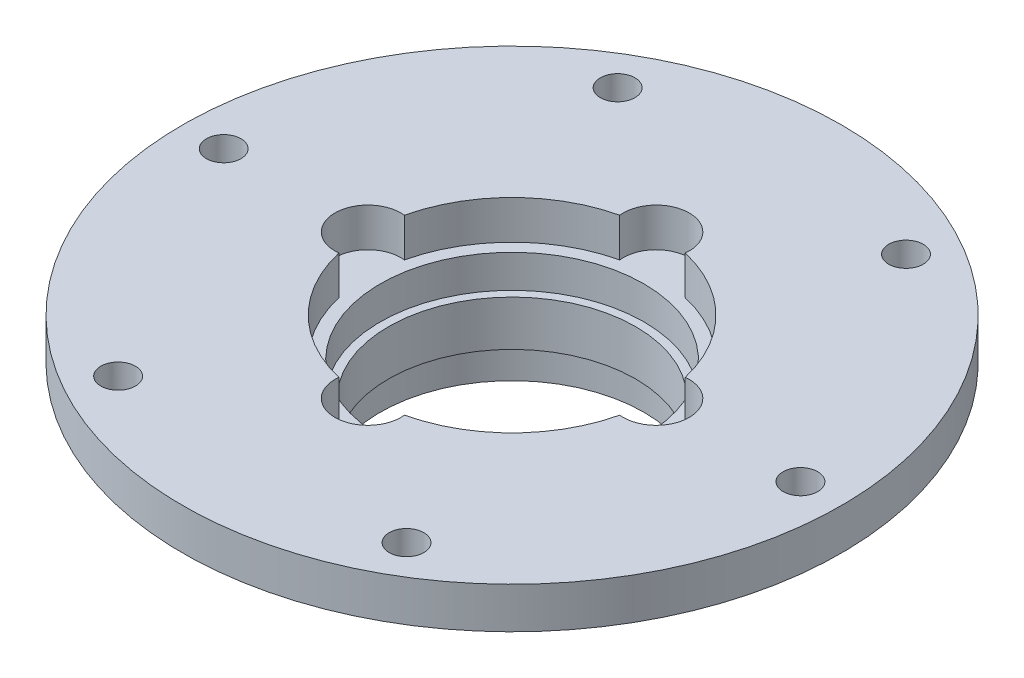
ISO-10303-21;
HEADER;
FILE_DESCRIPTION(('STEP AP214'),'2;1');
FILE_NAME('part.step','',(''),(''),'','','');
FILE_SCHEMA(('AUTOMOTIVE_DESIGN { 1 0 10303 214 1 1 1 1 }'));
ENDSEC;
DATA;
#1=APPLICATION_CONTEXT('core data for automotive mechanical design processes');
#2=APPLICATION_PROTOCOL_DEFINITION('international standard','automotive_design',2000,#1);
#3=PRODUCT_CONTEXT('',#1,'mechanical');
#4=PRODUCT('Part','Part','',(#3));
#5=PRODUCT_RELATED_PRODUCT_CATEGORY('part','',(#4));
#6=PRODUCT_DEFINITION_FORMATION('','',#4);
#7=PRODUCT_DEFINITION_CONTEXT('part definition',#1,'design');
#8=PRODUCT_DEFINITION('design','',#6,#7);
#9=PRODUCT_DEFINITION_SHAPE('','',#8);
#10=(LENGTH_UNIT() NAMED_UNIT(*) SI_UNIT(.MILLI.,.METRE.));
#11=(NAMED_UNIT(*) PLANE_ANGLE_UNIT() SI_UNIT($,.RADIAN.));
#12=(NAMED_UNIT(*) SI_UNIT($,.STERADIAN.) SOLID_ANGLE_UNIT());
#13=UNCERTAINTY_MEASURE_WITH_UNIT(LENGTH_MEASURE(1.E-05),#10,'distance_accuracy_value','');
#14=(GEOMETRIC_REPRESENTATION_CONTEXT(3) GLOBAL_UNCERTAINTY_ASSIGNED_CONTEXT((#13)) GLOBAL_UNIT_ASSIGNED_CONTEXT((#10,
#11,#12)) REPRESENTATION_CONTEXT('',''));
#15=CARTESIAN_POINT('',(0.,0.,0.));
#16=DIRECTION('',(0.,0.,1.));
#17=DIRECTION('',(1.,0.,0.));
#18=AXIS2_PLACEMENT_3D('',#15,#16,#17);
#19=CARTESIAN_POINT('',(0.,0.,0.));
#20=DIRECTION('',(0.,-1.,0.));
#21=DIRECTION('',(0.,0.,-1.));
#22=AXIS2_PLACEMENT_3D('',#19,#20,#21);
#23=CYLINDRICAL_SURFACE('',#22,17.5);
#24=DIRECTION('',(0.,1.,0.));
#25=VECTOR('',#24,1.);
#26=CARTESIAN_POINT('',(17.0428571428571,14.85,3.9737916915917));
#27=LINE('',#26,#25);
#28=CARTESIAN_POINT('',(17.0428571428571,12.5,3.9737916915917));
#29=VERTEX_POINT('',#28);
#30=CARTESIAN_POINT('',(17.0428571428571,17.2,3.97379169159171));
#31=VERTEX_POINT('',#30);
#32=EDGE_CURVE('E54',#29,#31,#27,.T.);
#33=ORIENTED_EDGE('',*,*,#32,.F.);
#34=CARTESIAN_POINT('',(0.,12.5,0.));
#35=DIRECTION('',(0.,-1.,0.));
#36=DIRECTION('',(0.,0.,-1.));
#37=AXIS2_PLACEMENT_3D('',#34,#35,#36);
#38=CIRCLE('',#37,17.5);
#39=CARTESIAN_POINT('',(3.97379169159171,12.5,17.0428571428571));
#40=VERTEX_POINT('',#39);
#41=EDGE_CURVE('E136',#29,#40,#38,.T.);
#42=ORIENTED_EDGE('',*,*,#41,.T.);
#43=DIRECTION('',(0.,1.,0.));
#44=VECTOR('',#43,1.);
#45=CARTESIAN_POINT('',(3.97379169159171,14.85,17.0428571428571));
#46=LINE('',#45,#44);
#47=CARTESIAN_POINT('',(3.97379169159171,17.2,17.0428571428571));
#48=VERTEX_POINT('',#47);
#49=EDGE_CURVE('E199',#48,#40,#46,.F.);
#50=ORIENTED_EDGE('',*,*,#49,.F.);
#51=CARTESIAN_POINT('',(0.,17.2,0.));
#52=DIRECTION('',(0.,-1.,0.));
#53=DIRECTION('',(0.,0.,-1.));
#54=AXIS2_PLACEMENT_3D('',#51,#52,#53);
#55=CIRCLE('',#54,17.5);
#56=EDGE_CURVE('E164',#31,#48,#55,.T.);
#57=ORIENTED_EDGE('',*,*,#56,.F.);
#58=EDGE_LOOP('',(#33,#42,#50,#57));
#59=FACE_BOUND('',#58,.T.);
#60=ADVANCED_FACE('F39',(#59),#23,.F.);
#61=DIRECTION('',(0.,1.,0.));
#62=VECTOR('',#61,1.);
#63=CARTESIAN_POINT('',(17.0428571428571,14.85,-3.9737916915917));
#64=LINE('',#63,#62);
#65=CARTESIAN_POINT('',(17.0428571428571,17.2,-3.9737916915917));
#66=VERTEX_POINT('',#65);
#67=CARTESIAN_POINT('',(17.0428571428571,12.5,-3.9737916915917));
#68=VERTEX_POINT('',#67);
#69=EDGE_CURVE('E205',#66,#68,#64,.F.);
#70=ORIENTED_EDGE('',*,*,#69,.F.);
#71=CARTESIAN_POINT('',(3.97379169159171,17.2,-17.0428571428571));
#72=VERTEX_POINT('',#71);
#73=EDGE_CURVE('E165',#72,#66,#55,.T.);
#74=ORIENTED_EDGE('',*,*,#73,.F.);
#75=DIRECTION('',(0.,1.,0.));
#76=VECTOR('',#75,1.);
#77=CARTESIAN_POINT('',(3.97379169159171,14.85,-17.0428571428571));
#78=LINE('',#77,#76);
#79=CARTESIAN_POINT('',(3.97379169159171,12.5,-17.0428571428571));
#80=VERTEX_POINT('',#79);
#81=EDGE_CURVE('E62',#80,#72,#78,.T.);
#82=ORIENTED_EDGE('',*,*,#81,.F.);
#83=EDGE_CURVE('E133',#80,#68,#38,.T.);
#84=ORIENTED_EDGE('',*,*,#83,.T.);
#85=EDGE_LOOP('',(#70,#74,#82,#84));
#86=FACE_BOUND('',#85,.T.);
#87=ADVANCED_FACE('F277',(#86),#23,.F.);
#88=DIRECTION('',(0.,1.,0.));
#89=VECTOR('',#88,1.);
#90=CARTESIAN_POINT('',(-3.97379169159171,14.85,-17.0428571428571));
#91=LINE('',#90,#89);
#92=CARTESIAN_POINT('',(-3.97379169159171,17.2,-17.0428571428571));
#93=VERTEX_POINT('',#92);
#94=CARTESIAN_POINT('',(-3.97379169159171,12.5,-17.0428571428571));
#95=VERTEX_POINT('',#94);
#96=EDGE_CURVE('E125',#93,#95,#91,.F.);
#97=ORIENTED_EDGE('',*,*,#96,.F.);
#98=CARTESIAN_POINT('',(-17.0428571428571,17.2,-3.97379169159171));
#99=VERTEX_POINT('',#98);
#100=EDGE_CURVE('E124',#99,#93,#55,.T.);
#101=ORIENTED_EDGE('',*,*,#100,.F.);
#102=DIRECTION('',(0.,1.,0.));
#103=VECTOR('',#102,1.);
#104=CARTESIAN_POINT('',(-17.0428571428571,14.85,-3.97379169159171));
#105=LINE('',#104,#103);
#106=CARTESIAN_POINT('',(-17.0428571428571,12.5,-3.97379169159171));
#107=VERTEX_POINT('',#106);
#108=EDGE_CURVE('E106',#107,#99,#105,.T.);
#109=ORIENTED_EDGE('',*,*,#108,.F.);
#110=EDGE_CURVE('E122',#107,#95,#38,.T.);
#111=ORIENTED_EDGE('',*,*,#110,.T.);
#112=EDGE_LOOP('',(#97,#101,#109,#111));
#113=FACE_BOUND('',#112,.T.);
#114=ADVANCED_FACE('F121',(#113),#23,.F.);
#115=CARTESIAN_POINT('',(0.,0.,0.));
#116=DIRECTION('',(0.,-1.,0.));
#117=DIRECTION('',(0.,0.,-1.));
#118=AXIS2_PLACEMENT_3D('',#115,#116,#117);
#119=CYLINDRICAL_SURFACE('',#118,15.);
#120=CARTESIAN_POINT('',(0.,3.,0.));
#121=DIRECTION('',(0.,-1.,0.));
#122=DIRECTION('',(0.,0.,-1.));
#123=AXIS2_PLACEMENT_3D('',#120,#121,#122);
#124=CIRCLE('',#123,15.);
#125=CARTESIAN_POINT('',(0.,3.,-15.));
#126=VERTEX_POINT('',#125);
#127=EDGE_CURVE('E194',#126,#126,#124,.T.);
#128=ORIENTED_EDGE('',*,*,#127,.T.);
#129=EDGE_LOOP('',(#128));
#130=FACE_BOUND('',#129,.T.);
#131=CARTESIAN_POINT('',(0.,8.5,0.));
#132=DIRECTION('',(0.,-1.,0.));
#133=DIRECTION('',(0.,0.,-1.));
#134=AXIS2_PLACEMENT_3D('',#131,#132,#133);
#135=CIRCLE('',#134,15.);
#136=CARTESIAN_POINT('',(0.,8.5,-15.));
#137=VERTEX_POINT('',#136);
#138=EDGE_CURVE('E147',#137,#137,#135,.T.);
#139=ORIENTED_EDGE('',*,*,#138,.F.);
#140=EDGE_LOOP('',(#139));
#141=FACE_BOUND('',#140,.T.);
#142=ADVANCED_FACE('F41',(#130,#141),#119,.F.);
#143=CARTESIAN_POINT('',(15.,8.5,0.));
#144=DIRECTION('',(0.,1.,0.));
#145=DIRECTION('',(0.,0.,1.));
#146=AXIS2_PLACEMENT_3D('',#143,#144,#145);
#147=PLANE('',#146);
#148=ORIENTED_EDGE('',*,*,#138,.T.);
#149=EDGE_LOOP('',(#148));
#150=FACE_BOUND('',#149,.T.);
#151=CARTESIAN_POINT('',(0.,8.5,0.));
#152=DIRECTION('',(0.,-1.,0.));
#153=DIRECTION('',(0.,0.,-1.));
#154=AXIS2_PLACEMENT_3D('',#151,#152,#153);
#155=CIRCLE('',#154,16.);
#156=CARTESIAN_POINT('',(0.,8.5,-16.));
#157=VERTEX_POINT('',#156);
#158=EDGE_CURVE('E144',#157,#157,#155,.T.);
#159=ORIENTED_EDGE('',*,*,#158,.F.);
#160=EDGE_LOOP('',(#159));
#161=FACE_BOUND('',#160,.T.);
#162=ADVANCED_FACE('F295',(#150,#161),#147,.T.);
#163=CARTESIAN_POINT('',(0.,0.,0.));
#164=DIRECTION('',(0.,-1.,0.));
#165=DIRECTION('',(0.,0.,-1.));
#166=AXIS2_PLACEMENT_3D('',#163,#164,#165);
#167=CYLINDRICAL_SURFACE('',#166,16.);
#168=ORIENTED_EDGE('',*,*,#158,.T.);
#169=EDGE_LOOP('',(#168));
#170=FACE_BOUND('',#169,.T.);
#171=CARTESIAN_POINT('',(0.,12.5,0.));
#172=DIRECTION('',(0.,-1.,0.));
#173=DIRECTION('',(0.,0.,-1.));
#174=AXIS2_PLACEMENT_3D('',#171,#172,#173);
#175=CIRCLE('',#174,16.);
#176=CARTESIAN_POINT('',(0.,12.5,-16.));
#177=VERTEX_POINT('',#176);
#178=EDGE_CURVE('E135',#177,#177,#175,.T.);
#179=ORIENTED_EDGE('',*,*,#178,.F.);
#180=EDGE_LOOP('',(#179));
#181=FACE_BOUND('',#180,.T.);
#182=ADVANCED_FACE('F289',(#170,#181),#167,.F.);
#183=CARTESIAN_POINT('',(16.,12.5,0.));
#184=DIRECTION('',(0.,1.,0.));
#185=DIRECTION('',(0.,0.,1.));
#186=AXIS2_PLACEMENT_3D('',#183,#184,#185);
#187=PLANE('',#186);
#188=ORIENTED_EDGE('',*,*,#178,.T.);
#189=EDGE_LOOP('',(#188));
#190=FACE_BOUND('',#189,.T.);
#191=CARTESIAN_POINT('',(17.5,12.5,0.));
#192=DIRECTION('',(0.,1.,0.));
#193=DIRECTION('',(0.,0.,1.));
#194=AXIS2_PLACEMENT_3D('',#191,#192,#193);
#195=CIRCLE('',#194,4.);
#196=EDGE_CURVE('E159',#68,#29,#195,.F.);
#197=ORIENTED_EDGE('',*,*,#196,.F.);
#198=ORIENTED_EDGE('',*,*,#83,.F.);
#199=CARTESIAN_POINT('',(0.,12.5,-17.5));
#200=DIRECTION('',(0.,1.,0.));
#201=DIRECTION('',(0.,0.,1.));
#202=AXIS2_PLACEMENT_3D('',#199,#200,#201);
#203=CIRCLE('',#202,4.);
#204=EDGE_CURVE('E131',#95,#80,#203,.F.);
#205=ORIENTED_EDGE('',*,*,#204,.F.);
#206=ORIENTED_EDGE('',*,*,#110,.F.);
#207=CARTESIAN_POINT('',(-17.5,12.5,0.));
#208=DIRECTION('',(0.,1.,0.));
#209=DIRECTION('',(0.,0.,1.));
#210=AXIS2_PLACEMENT_3D('',#207,#208,#209);
#211=CIRCLE('',#210,4.);
#212=CARTESIAN_POINT('',(-17.0428571428571,12.5,3.97379169159171));
#213=VERTEX_POINT('',#212);
#214=EDGE_CURVE('E103',#213,#107,#211,.F.);
#215=ORIENTED_EDGE('',*,*,#214,.F.);
#216=CARTESIAN_POINT('',(-3.97379169159171,12.5,17.0428571428571));
#217=VERTEX_POINT('',#216);
#218=EDGE_CURVE('E132',#217,#213,#38,.T.);
#219=ORIENTED_EDGE('',*,*,#218,.F.);
#220=CARTESIAN_POINT('',(0.,12.5,17.5));
#221=DIRECTION('',(0.,1.,0.));
#222=DIRECTION('',(0.,0.,1.));
#223=AXIS2_PLACEMENT_3D('',#220,#221,#222);
#224=CIRCLE('',#223,4.);
#225=EDGE_CURVE('E202',#40,#217,#224,.F.);
#226=ORIENTED_EDGE('',*,*,#225,.F.);
#227=ORIENTED_EDGE('',*,*,#41,.F.);
#228=EDGE_LOOP('',(#197,#198,#205,#206,#215,#219,#226,#227));
#229=FACE_BOUND('',#228,.T.);
#230=ADVANCED_FACE('F129',(#190,#229),#187,.T.);
#231=DIRECTION('',(0.,1.,0.));
#232=VECTOR('',#231,1.);
#233=CARTESIAN_POINT('',(-17.0428571428571,14.85,3.97379169159171));
#234=LINE('',#233,#232);
#235=CARTESIAN_POINT('',(-17.0428571428571,17.2,3.97379169159171));
#236=VERTEX_POINT('',#235);
#237=EDGE_CURVE('E109',#236,#213,#234,.F.);
#238=ORIENTED_EDGE('',*,*,#237,.F.);
#239=CARTESIAN_POINT('',(-3.97379169159171,17.2,17.0428571428571));
#240=VERTEX_POINT('',#239);
#241=EDGE_CURVE('E140',#240,#236,#55,.T.);
#242=ORIENTED_EDGE('',*,*,#241,.F.);
#243=DIRECTION('',(0.,1.,0.));
#244=VECTOR('',#243,1.);
#245=CARTESIAN_POINT('',(-3.97379169159171,14.85,17.0428571428571));
#246=LINE('',#245,#244);
#247=EDGE_CURVE('E197',#217,#240,#246,.T.);
#248=ORIENTED_EDGE('',*,*,#247,.F.);
#249=ORIENTED_EDGE('',*,*,#218,.T.);
#250=EDGE_LOOP('',(#238,#242,#248,#249));
#251=FACE_BOUND('',#250,.T.);
#252=ADVANCED_FACE('F157',(#251),#23,.F.);
#253=CARTESIAN_POINT('',(21.5,17.2,0.));
#254=DIRECTION('',(0.,1.,0.));
#255=DIRECTION('',(0.,0.,1.));
#256=AXIS2_PLACEMENT_3D('',#253,#254,#255);
#257=PLANE('',#256);
#258=CARTESIAN_POINT('',(17.5000000000004,17.2,-30.3108891324552));
#259=DIRECTION('',(0.,1.,0.));
#260=DIRECTION('',(0.,0.,1.));
#261=AXIS2_PLACEMENT_3D('',#258,#259,#260);
#262=CIRCLE('',#261,2.09999999999999);
#263=CARTESIAN_POINT('',(17.5000000000004,17.2,-28.2108891324552));
#264=VERTEX_POINT('',#263);
#265=EDGE_CURVE('E241',#264,#264,#262,.T.);
#266=ORIENTED_EDGE('',*,*,#265,.F.);
#267=EDGE_LOOP('',(#266));
#268=FACE_BOUND('',#267,.T.);
#269=CARTESIAN_POINT('',(35.,17.2,0.));
#270=DIRECTION('',(0.,1.,0.));
#271=DIRECTION('',(0.,0.,1.));
#272=AXIS2_PLACEMENT_3D('',#269,#270,#271);
#273=CIRCLE('',#272,2.09999999999999);
#274=CARTESIAN_POINT('',(35.,17.2,2.09999999999999));
#275=VERTEX_POINT('',#274);
#276=EDGE_CURVE('E235',#275,#275,#273,.T.);
#277=ORIENTED_EDGE('',*,*,#276,.F.);
#278=EDGE_LOOP('',(#277));
#279=FACE_BOUND('',#278,.T.);
#280=CARTESIAN_POINT('',(17.4999999999999,17.2,30.3108891324554));
#281=DIRECTION('',(0.,1.,0.));
#282=DIRECTION('',(0.,0.,1.));
#283=AXIS2_PLACEMENT_3D('',#280,#281,#282);
#284=CIRCLE('',#283,2.09999999999999);
#285=CARTESIAN_POINT('',(17.4999999999999,17.2,32.4108891324554));
#286=VERTEX_POINT('',#285);
#287=EDGE_CURVE('E232',#286,#286,#284,.T.);
#288=ORIENTED_EDGE('',*,*,#287,.F.);
#289=EDGE_LOOP('',(#288));
#290=FACE_BOUND('',#289,.T.);
#291=CARTESIAN_POINT('',(-17.5000000000001,17.2,30.3108891324553));
#292=DIRECTION('',(0.,1.,0.));
#293=DIRECTION('',(0.,0.,1.));
#294=AXIS2_PLACEMENT_3D('',#291,#292,#293);
#295=CIRCLE('',#294,2.09999999999999);
#296=CARTESIAN_POINT('',(-17.5000000000001,17.2,32.4108891324553));
#297=VERTEX_POINT('',#296);
#298=EDGE_CURVE('E226',#297,#297,#295,.T.);
#299=ORIENTED_EDGE('',*,*,#298,.F.);
#300=EDGE_LOOP('',(#299));
#301=FACE_BOUND('',#300,.T.);
#302=CARTESIAN_POINT('',(-35.,17.2,-2.44403693719019E-13));
#303=DIRECTION('',(0.,1.,0.));
#304=DIRECTION('',(0.,0.,1.));
#305=AXIS2_PLACEMENT_3D('',#302,#303,#304);
#306=CIRCLE('',#305,2.09999999999999);
#307=CARTESIAN_POINT('',(-35.,17.2,2.09999999999975));
#308=VERTEX_POINT('',#307);
#309=EDGE_CURVE('E220',#308,#308,#306,.T.);
#310=ORIENTED_EDGE('',*,*,#309,.F.);
#311=EDGE_LOOP('',(#310));
#312=FACE_BOUND('',#311,.T.);
#313=CARTESIAN_POINT('',(-17.4999999999997,17.2,-30.3108891324555));
#314=DIRECTION('',(0.,1.,0.));
#315=DIRECTION('',(0.,0.,1.));
#316=AXIS2_PLACEMENT_3D('',#313,#314,#315);
#317=CIRCLE('',#316,2.09999999999999);
#318=CARTESIAN_POINT('',(-17.4999999999997,17.2,-28.2108891324555));
#319=VERTEX_POINT('',#318);
#320=EDGE_CURVE('E214',#319,#319,#317,.T.);
#321=ORIENTED_EDGE('',*,*,#320,.F.);
#322=EDGE_LOOP('',(#321));
#323=FACE_BOUND('',#322,.T.);
#324=CARTESIAN_POINT('',(17.5,17.2,0.));
#325=DIRECTION('',(0.,1.,0.));
#326=DIRECTION('',(0.,0.,1.));
#327=AXIS2_PLACEMENT_3D('',#324,#325,#326);
#328=CIRCLE('',#327,4.);
#329=EDGE_CURVE('E11',#31,#66,#328,.T.);
#330=ORIENTED_EDGE('',*,*,#329,.F.);
#331=ORIENTED_EDGE('',*,*,#56,.T.);
#332=CARTESIAN_POINT('',(0.,17.2,17.5));
#333=DIRECTION('',(0.,1.,0.));
#334=DIRECTION('',(0.,0.,1.));
#335=AXIS2_PLACEMENT_3D('',#332,#333,#334);
#336=CIRCLE('',#335,4.);
#337=EDGE_CURVE('E150',#240,#48,#336,.T.);
#338=ORIENTED_EDGE('',*,*,#337,.F.);
#339=ORIENTED_EDGE('',*,*,#241,.T.);
#340=CARTESIAN_POINT('',(-17.5,17.2,0.));
#341=DIRECTION('',(0.,1.,0.));
#342=DIRECTION('',(0.,0.,1.));
#343=AXIS2_PLACEMENT_3D('',#340,#341,#342);
#344=CIRCLE('',#343,4.);
#345=EDGE_CURVE('E48',#99,#236,#344,.T.);
#346=ORIENTED_EDGE('',*,*,#345,.F.);
#347=ORIENTED_EDGE('',*,*,#100,.T.);
#348=CARTESIAN_POINT('',(0.,17.2,-17.5));
#349=DIRECTION('',(0.,1.,0.));
#350=DIRECTION('',(0.,0.,1.));
#351=AXIS2_PLACEMENT_3D('',#348,#349,#350);
#352=CIRCLE('',#351,4.);
#353=EDGE_CURVE('E114',#72,#93,#352,.T.);
#354=ORIENTED_EDGE('',*,*,#353,.F.);
#355=ORIENTED_EDGE('',*,*,#73,.T.);
#356=EDGE_LOOP('',(#330,#331,#338,#339,#346,#347,#354,#355));
#357=FACE_BOUND('',#356,.T.);
#358=CARTESIAN_POINT('',(0.,17.2,0.));
#359=DIRECTION('',(0.,-1.,0.));
#360=DIRECTION('',(0.,0.,-1.));
#361=AXIS2_PLACEMENT_3D('',#358,#359,#360);
#362=CIRCLE('',#361,40.);
#363=CARTESIAN_POINT('',(0.,17.2,-40.));
#364=VERTEX_POINT('',#363);
#365=EDGE_CURVE('E166',#364,#364,#362,.T.);
#366=ORIENTED_EDGE('',*,*,#365,.F.);
#367=EDGE_LOOP('',(#366));
#368=FACE_BOUND('',#367,.T.);
#369=ADVANCED_FACE('F162',(#268,#279,#290,#301,#312,#323,#357,#368),#257,.T.);
#370=CARTESIAN_POINT('',(0.,0.,0.));
#371=DIRECTION('',(0.,-1.,0.));
#372=DIRECTION('',(0.,0.,-1.));
#373=AXIS2_PLACEMENT_3D('',#370,#371,#372);
#374=CYLINDRICAL_SURFACE('',#373,40.);
#375=ORIENTED_EDGE('',*,*,#365,.T.);
#376=EDGE_LOOP('',(#375));
#377=FACE_BOUND('',#376,.T.);
#378=CARTESIAN_POINT('',(0.,12.2,0.));
#379=DIRECTION('',(0.,-1.,0.));
#380=DIRECTION('',(0.,0.,-1.));
#381=AXIS2_PLACEMENT_3D('',#378,#379,#380);
#382=CIRCLE('',#381,40.);
#383=CARTESIAN_POINT('',(0.,12.2,-40.));
#384=VERTEX_POINT('',#383);
#385=EDGE_CURVE('E170',#384,#384,#382,.T.);
#386=ORIENTED_EDGE('',*,*,#385,.F.);
#387=EDGE_LOOP('',(#386));
#388=FACE_BOUND('',#387,.T.);
#389=ADVANCED_FACE('F249',(#377,#388),#374,.T.);
#390=CARTESIAN_POINT('',(40.,12.2,0.));
#391=DIRECTION('',(0.,-1.,0.));
#392=DIRECTION('',(0.,0.,-1.));
#393=AXIS2_PLACEMENT_3D('',#390,#391,#392);
#394=PLANE('',#393);
#395=CARTESIAN_POINT('',(17.5000000000004,12.2,-30.3108891324552));
#396=DIRECTION('',(0.,-1.,0.));
#397=DIRECTION('',(0.,0.,-1.));
#398=AXIS2_PLACEMENT_3D('',#395,#396,#397);
#399=CIRCLE('',#398,2.09999999999999);
#400=CARTESIAN_POINT('',(17.5000000000004,12.2,-32.4108891324551));
#401=VERTEX_POINT('',#400);
#402=EDGE_CURVE('E238',#401,#401,#399,.T.);
#403=ORIENTED_EDGE('',*,*,#402,.F.);
#404=EDGE_LOOP('',(#403));
#405=FACE_BOUND('',#404,.T.);
#406=CARTESIAN_POINT('',(35.,12.2,0.));
#407=DIRECTION('',(0.,-1.,0.));
#408=DIRECTION('',(0.,0.,-1.));
#409=AXIS2_PLACEMENT_3D('',#406,#407,#408);
#410=CIRCLE('',#409,2.09999999999999);
#411=CARTESIAN_POINT('',(35.,12.2,-2.09999999999999));
#412=VERTEX_POINT('',#411);
#413=EDGE_CURVE('E43',#412,#412,#410,.T.);
#414=ORIENTED_EDGE('',*,*,#413,.F.);
#415=EDGE_LOOP('',(#414));
#416=FACE_BOUND('',#415,.T.);
#417=CARTESIAN_POINT('',(17.4999999999999,12.2,30.3108891324554));
#418=DIRECTION('',(0.,-1.,0.));
#419=DIRECTION('',(0.,0.,-1.));
#420=AXIS2_PLACEMENT_3D('',#417,#418,#419);
#421=CIRCLE('',#420,2.09999999999999);
#422=CARTESIAN_POINT('',(17.4999999999999,12.2,28.2108891324554));
#423=VERTEX_POINT('',#422);
#424=EDGE_CURVE('E229',#423,#423,#421,.T.);
#425=ORIENTED_EDGE('',*,*,#424,.F.);
#426=EDGE_LOOP('',(#425));
#427=FACE_BOUND('',#426,.T.);
#428=CARTESIAN_POINT('',(-17.5000000000001,12.2,30.3108891324553));
#429=DIRECTION('',(0.,-1.,0.));
#430=DIRECTION('',(0.,0.,-1.));
#431=AXIS2_PLACEMENT_3D('',#428,#429,#430);
#432=CIRCLE('',#431,2.09999999999999);
#433=CARTESIAN_POINT('',(-17.5000000000001,12.2,28.2108891324553));
#434=VERTEX_POINT('',#433);
#435=EDGE_CURVE('E223',#434,#434,#432,.T.);
#436=ORIENTED_EDGE('',*,*,#435,.F.);
#437=EDGE_LOOP('',(#436));
#438=FACE_BOUND('',#437,.T.);
#439=CARTESIAN_POINT('',(-35.,12.2,-2.44403693719019E-13));
#440=DIRECTION('',(0.,-1.,0.));
#441=DIRECTION('',(0.,0.,-1.));
#442=AXIS2_PLACEMENT_3D('',#439,#440,#441);
#443=CIRCLE('',#442,2.09999999999999);
#444=CARTESIAN_POINT('',(-35.,12.2,-2.10000000000024));
#445=VERTEX_POINT('',#444);
#446=EDGE_CURVE('E217',#445,#445,#443,.T.);
#447=ORIENTED_EDGE('',*,*,#446,.F.);
#448=EDGE_LOOP('',(#447));
#449=FACE_BOUND('',#448,.T.);
#450=CARTESIAN_POINT('',(-17.4999999999997,12.2,-30.3108891324555));
#451=DIRECTION('',(0.,-1.,0.));
#452=DIRECTION('',(0.,0.,-1.));
#453=AXIS2_PLACEMENT_3D('',#450,#451,#452);
#454=CIRCLE('',#453,2.09999999999999);
#455=CARTESIAN_POINT('',(-17.4999999999997,12.2,-32.4108891324555));
#456=VERTEX_POINT('',#455);
#457=EDGE_CURVE('E115',#456,#456,#454,.T.);
#458=ORIENTED_EDGE('',*,*,#457,.F.);
#459=EDGE_LOOP('',(#458));
#460=FACE_BOUND('',#459,.T.);
#461=ORIENTED_EDGE('',*,*,#385,.T.);
#462=EDGE_LOOP('',(#461));
#463=FACE_BOUND('',#462,.T.);
#464=CARTESIAN_POINT('',(0.,12.2,0.));
#465=DIRECTION('',(0.,-1.,0.));
#466=DIRECTION('',(0.,0.,-1.));
#467=AXIS2_PLACEMENT_3D('',#464,#465,#466);
#468=CIRCLE('',#467,24.);
#469=CARTESIAN_POINT('',(0.,12.2,-24.));
#470=VERTEX_POINT('',#469);
#471=EDGE_CURVE('E174',#470,#470,#468,.T.);
#472=ORIENTED_EDGE('',*,*,#471,.F.);
#473=EDGE_LOOP('',(#472));
#474=FACE_BOUND('',#473,.T.);
#475=ADVANCED_FACE('F374',(#405,#416,#427,#438,#449,#460,#463,#474),#394,.T.);
#476=CARTESIAN_POINT('',(0.,0.,0.));
#477=DIRECTION('',(0.,-1.,0.));
#478=DIRECTION('',(0.,0.,-1.));
#479=AXIS2_PLACEMENT_3D('',#476,#477,#478);
#480=CYLINDRICAL_SURFACE('',#479,24.);
#481=ORIENTED_EDGE('',*,*,#471,.T.);
#482=EDGE_LOOP('',(#481));
#483=FACE_BOUND('',#482,.T.);
#484=CARTESIAN_POINT('',(0.,6.,0.));
#485=DIRECTION('',(0.,-1.,0.));
#486=DIRECTION('',(0.,0.,-1.));
#487=AXIS2_PLACEMENT_3D('',#484,#485,#486);
#488=CIRCLE('',#487,24.);
#489=CARTESIAN_POINT('',(0.,6.,-24.));
#490=VERTEX_POINT('',#489);
#491=EDGE_CURVE('E179',#490,#490,#488,.T.);
#492=ORIENTED_EDGE('',*,*,#491,.F.);
#493=EDGE_LOOP('',(#492));
#494=FACE_BOUND('',#493,.T.);
#495=ADVANCED_FACE('F379',(#483,#494),#480,.T.);
#496=CARTESIAN_POINT('',(24.,6.,0.));
#497=DIRECTION('',(0.,-1.,0.));
#498=DIRECTION('',(0.,0.,-1.));
#499=AXIS2_PLACEMENT_3D('',#496,#497,#498);
#500=PLANE('',#499);
#501=ORIENTED_EDGE('',*,*,#491,.T.);
#502=EDGE_LOOP('',(#501));
#503=FACE_BOUND('',#502,.T.);
#504=CARTESIAN_POINT('',(0.,6.,0.));
#505=DIRECTION('',(0.,-1.,0.));
#506=DIRECTION('',(0.,0.,-1.));
#507=AXIS2_PLACEMENT_3D('',#504,#505,#506);
#508=CIRCLE('',#507,19.);
#509=CARTESIAN_POINT('',(0.,6.,-19.));
#510=VERTEX_POINT('',#509);
#511=EDGE_CURVE('E182',#510,#510,#508,.T.);
#512=ORIENTED_EDGE('',*,*,#511,.F.);
#513=EDGE_LOOP('',(#512));
#514=FACE_BOUND('',#513,.T.);
#515=ADVANCED_FACE('F474',(#503,#514),#500,.T.);
#516=CARTESIAN_POINT('',(0.,0.,0.));
#517=DIRECTION('',(0.,-1.,0.));
#518=DIRECTION('',(0.,0.,-1.));
#519=AXIS2_PLACEMENT_3D('',#516,#517,#518);
#520=CYLINDRICAL_SURFACE('',#519,19.);
#521=ORIENTED_EDGE('',*,*,#511,.T.);
#522=EDGE_LOOP('',(#521));
#523=FACE_BOUND('',#522,.T.);
#524=CARTESIAN_POINT('',(0.,-1.,0.));
#525=DIRECTION('',(0.,-1.,0.));
#526=DIRECTION('',(0.,0.,-1.));
#527=AXIS2_PLACEMENT_3D('',#524,#525,#526);
#528=CIRCLE('',#527,19.);
#529=CARTESIAN_POINT('',(0.,-1.,-19.));
#530=VERTEX_POINT('',#529);
#531=EDGE_CURVE('E185',#530,#530,#528,.T.);
#532=ORIENTED_EDGE('',*,*,#531,.F.);
#533=EDGE_LOOP('',(#532));
#534=FACE_BOUND('',#533,.T.);
#535=ADVANCED_FACE('F480',(#523,#534),#520,.T.);
#536=CARTESIAN_POINT('',(19.,-1.,0.));
#537=DIRECTION('',(0.,-1.,0.));
#538=DIRECTION('',(0.,0.,-1.));
#539=AXIS2_PLACEMENT_3D('',#536,#537,#538);
#540=PLANE('',#539);
#541=ORIENTED_EDGE('',*,*,#531,.T.);
#542=EDGE_LOOP('',(#541));
#543=FACE_BOUND('',#542,.T.);
#544=CARTESIAN_POINT('',(0.,-1.,0.));
#545=DIRECTION('',(0.,-1.,0.));
#546=DIRECTION('',(0.,0.,-1.));
#547=AXIS2_PLACEMENT_3D('',#544,#545,#546);
#548=CIRCLE('',#547,16.);
#549=CARTESIAN_POINT('',(0.,-1.,-16.));
#550=VERTEX_POINT('',#549);
#551=EDGE_CURVE('E188',#550,#550,#548,.T.);
#552=ORIENTED_EDGE('',*,*,#551,.F.);
#553=EDGE_LOOP('',(#552));
#554=FACE_BOUND('',#553,.T.);
#555=ADVANCED_FACE('F486',(#543,#554),#540,.T.);
#556=CARTESIAN_POINT('',(0.,0.,0.));
#557=DIRECTION('',(0.,-1.,0.));
#558=DIRECTION('',(0.,0.,-1.));
#559=AXIS2_PLACEMENT_3D('',#556,#557,#558);
#560=CYLINDRICAL_SURFACE('',#559,16.);
#561=ORIENTED_EDGE('',*,*,#551,.T.);
#562=EDGE_LOOP('',(#561));
#563=FACE_BOUND('',#562,.T.);
#564=CARTESIAN_POINT('',(0.,3.,0.));
#565=DIRECTION('',(0.,-1.,0.));
#566=DIRECTION('',(0.,0.,-1.));
#567=AXIS2_PLACEMENT_3D('',#564,#565,#566);
#568=CIRCLE('',#567,16.);
#569=CARTESIAN_POINT('',(0.,3.,-16.));
#570=VERTEX_POINT('',#569);
#571=EDGE_CURVE('E191',#570,#570,#568,.T.);
#572=ORIENTED_EDGE('',*,*,#571,.F.);
#573=EDGE_LOOP('',(#572));
#574=FACE_BOUND('',#573,.T.);
#575=ADVANCED_FACE('F492',(#563,#574),#560,.F.);
#576=CARTESIAN_POINT('',(16.,3.,0.));
#577=DIRECTION('',(0.,-1.,0.));
#578=DIRECTION('',(0.,0.,-1.));
#579=AXIS2_PLACEMENT_3D('',#576,#577,#578);
#580=PLANE('',#579);
#581=ORIENTED_EDGE('',*,*,#571,.T.);
#582=EDGE_LOOP('',(#581));
#583=FACE_BOUND('',#582,.T.);
#584=ORIENTED_EDGE('',*,*,#127,.F.);
#585=EDGE_LOOP('',(#584));
#586=FACE_BOUND('',#585,.T.);
#587=ADVANCED_FACE('F336',(#583,#586),#580,.T.);
#588=CARTESIAN_POINT('',(0.,1.18629150101524,17.5));
#589=DIRECTION('',(0.,1.,0.));
#590=DIRECTION('',(0.,0.,1.));
#591=AXIS2_PLACEMENT_3D('',#588,#589,#590);
#592=CYLINDRICAL_SURFACE('',#591,4.);
#593=ORIENTED_EDGE('',*,*,#247,.T.);
#594=ORIENTED_EDGE('',*,*,#337,.T.);
#595=ORIENTED_EDGE('',*,*,#49,.T.);
#596=ORIENTED_EDGE('',*,*,#225,.T.);
#597=EDGE_LOOP('',(#593,#594,#595,#596));
#598=FACE_BOUND('',#597,.T.);
#599=ADVANCED_FACE('F332',(#598),#592,.F.);
#600=CARTESIAN_POINT('',(-17.5,1.18629150101524,0.));
#601=DIRECTION('',(0.,1.,0.));
#602=DIRECTION('',(0.,0.,1.));
#603=AXIS2_PLACEMENT_3D('',#600,#601,#602);
#604=CYLINDRICAL_SURFACE('',#603,4.);
#605=ORIENTED_EDGE('',*,*,#108,.T.);
#606=ORIENTED_EDGE('',*,*,#345,.T.);
#607=ORIENTED_EDGE('',*,*,#237,.T.);
#608=ORIENTED_EDGE('',*,*,#214,.T.);
#609=EDGE_LOOP('',(#605,#606,#607,#608));
#610=FACE_BOUND('',#609,.T.);
#611=ADVANCED_FACE('F105',(#610),#604,.F.);
#612=CARTESIAN_POINT('',(0.,1.18629150101524,-17.5));
#613=DIRECTION('',(0.,1.,0.));
#614=DIRECTION('',(0.,0.,1.));
#615=AXIS2_PLACEMENT_3D('',#612,#613,#614);
#616=CYLINDRICAL_SURFACE('',#615,4.);
#617=ORIENTED_EDGE('',*,*,#81,.T.);
#618=ORIENTED_EDGE('',*,*,#353,.T.);
#619=ORIENTED_EDGE('',*,*,#96,.T.);
#620=ORIENTED_EDGE('',*,*,#204,.T.);
#621=EDGE_LOOP('',(#617,#618,#619,#620));
#622=FACE_BOUND('',#621,.T.);
#623=ADVANCED_FACE('F274',(#622),#616,.F.);
#624=CARTESIAN_POINT('',(17.5,1.18629150101524,0.));
#625=DIRECTION('',(0.,1.,0.));
#626=DIRECTION('',(0.,0.,1.));
#627=AXIS2_PLACEMENT_3D('',#624,#625,#626);
#628=CYLINDRICAL_SURFACE('',#627,4.);
#629=ORIENTED_EDGE('',*,*,#32,.T.);
#630=ORIENTED_EDGE('',*,*,#329,.T.);
#631=ORIENTED_EDGE('',*,*,#69,.T.);
#632=ORIENTED_EDGE('',*,*,#196,.T.);
#633=EDGE_LOOP('',(#629,#630,#631,#632));
#634=FACE_BOUND('',#633,.T.);
#635=ADVANCED_FACE('F264',(#634),#628,.F.);
#636=CARTESIAN_POINT('',(-17.4999999999997,17.2,-30.3108891324555));
#637=DIRECTION('',(0.,1.,0.));
#638=DIRECTION('',(0.,0.,1.));
#639=AXIS2_PLACEMENT_3D('',#636,#637,#638);
#640=CYLINDRICAL_SURFACE('',#639,2.09999999999999);
#641=ORIENTED_EDGE('',*,*,#457,.T.);
#642=EDGE_LOOP('',(#641));
#643=FACE_BOUND('',#642,.T.);
#644=ORIENTED_EDGE('',*,*,#320,.T.);
#645=EDGE_LOOP('',(#644));
#646=FACE_BOUND('',#645,.T.);
#647=ADVANCED_FACE('F261',(#643,#646),#640,.F.);
#648=CARTESIAN_POINT('',(-35.,17.2,-2.44403693719019E-13));
#649=DIRECTION('',(0.,1.,0.));
#650=DIRECTION('',(0.,0.,1.));
#651=AXIS2_PLACEMENT_3D('',#648,#649,#650);
#652=CYLINDRICAL_SURFACE('',#651,2.09999999999999);
#653=ORIENTED_EDGE('',*,*,#446,.T.);
#654=EDGE_LOOP('',(#653));
#655=FACE_BOUND('',#654,.T.);
#656=ORIENTED_EDGE('',*,*,#309,.T.);
#657=EDGE_LOOP('',(#656));
#658=FACE_BOUND('',#657,.T.);
#659=ADVANCED_FACE('F263',(#655,#658),#652,.F.);
#660=CARTESIAN_POINT('',(-17.5000000000001,17.2,30.3108891324553));
#661=DIRECTION('',(0.,1.,0.));
#662=DIRECTION('',(0.,0.,1.));
#663=AXIS2_PLACEMENT_3D('',#660,#661,#662);
#664=CYLINDRICAL_SURFACE('',#663,2.09999999999999);
#665=ORIENTED_EDGE('',*,*,#435,.T.);
#666=EDGE_LOOP('',(#665));
#667=FACE_BOUND('',#666,.T.);
#668=ORIENTED_EDGE('',*,*,#298,.T.);
#669=EDGE_LOOP('',(#668));
#670=FACE_BOUND('',#669,.T.);
#671=ADVANCED_FACE('F271',(#667,#670),#664,.F.);
#672=CARTESIAN_POINT('',(17.4999999999999,17.2,30.3108891324554));
#673=DIRECTION('',(0.,1.,0.));
#674=DIRECTION('',(0.,0.,1.));
#675=AXIS2_PLACEMENT_3D('',#672,#673,#674);
#676=CYLINDRICAL_SURFACE('',#675,2.09999999999999);
#677=ORIENTED_EDGE('',*,*,#424,.T.);
#678=EDGE_LOOP('',(#677));
#679=FACE_BOUND('',#678,.T.);
#680=ORIENTED_EDGE('',*,*,#287,.T.);
#681=EDGE_LOOP('',(#680));
#682=FACE_BOUND('',#681,.T.);
#683=ADVANCED_FACE('F404',(#679,#682),#676,.F.);
#684=CARTESIAN_POINT('',(35.,17.2,0.));
#685=DIRECTION('',(0.,1.,0.));
#686=DIRECTION('',(0.,0.,1.));
#687=AXIS2_PLACEMENT_3D('',#684,#685,#686);
#688=CYLINDRICAL_SURFACE('',#687,2.09999999999999);
#689=ORIENTED_EDGE('',*,*,#413,.T.);
#690=EDGE_LOOP('',(#689));
#691=FACE_BOUND('',#690,.T.);
#692=ORIENTED_EDGE('',*,*,#276,.T.);
#693=EDGE_LOOP('',(#692));
#694=FACE_BOUND('',#693,.T.);
#695=ADVANCED_FACE('F415',(#691,#694),#688,.F.);
#696=CARTESIAN_POINT('',(17.5000000000004,17.2,-30.3108891324552));
#697=DIRECTION('',(0.,1.,0.));
#698=DIRECTION('',(0.,0.,1.));
#699=AXIS2_PLACEMENT_3D('',#696,#697,#698);
#700=CYLINDRICAL_SURFACE('',#699,2.09999999999999);
#701=ORIENTED_EDGE('',*,*,#402,.T.);
#702=EDGE_LOOP('',(#701));
#703=FACE_BOUND('',#702,.T.);
#704=ORIENTED_EDGE('',*,*,#265,.T.);
#705=EDGE_LOOP('',(#704));
#706=FACE_BOUND('',#705,.T.);
#707=ADVANCED_FACE('F245',(#703,#706),#700,.F.);
#708=CLOSED_SHELL('',(#60,#87,#114,#142,#162,#182,#230,#252,#369,#389,#475,#495,#515,#535,#555,
#575,#587,#599,#611,#623,#635,#647,#659,#671,#683,#695,#707));
#709=MANIFOLD_SOLID_BREP('B2',#708);
#710=ADVANCED_BREP_SHAPE_REPRESENTATION('',(#18,#709),#14);
#711=SHAPE_DEFINITION_REPRESENTATION(#9,#710);
ENDSEC;
END-ISO-10303-21;
